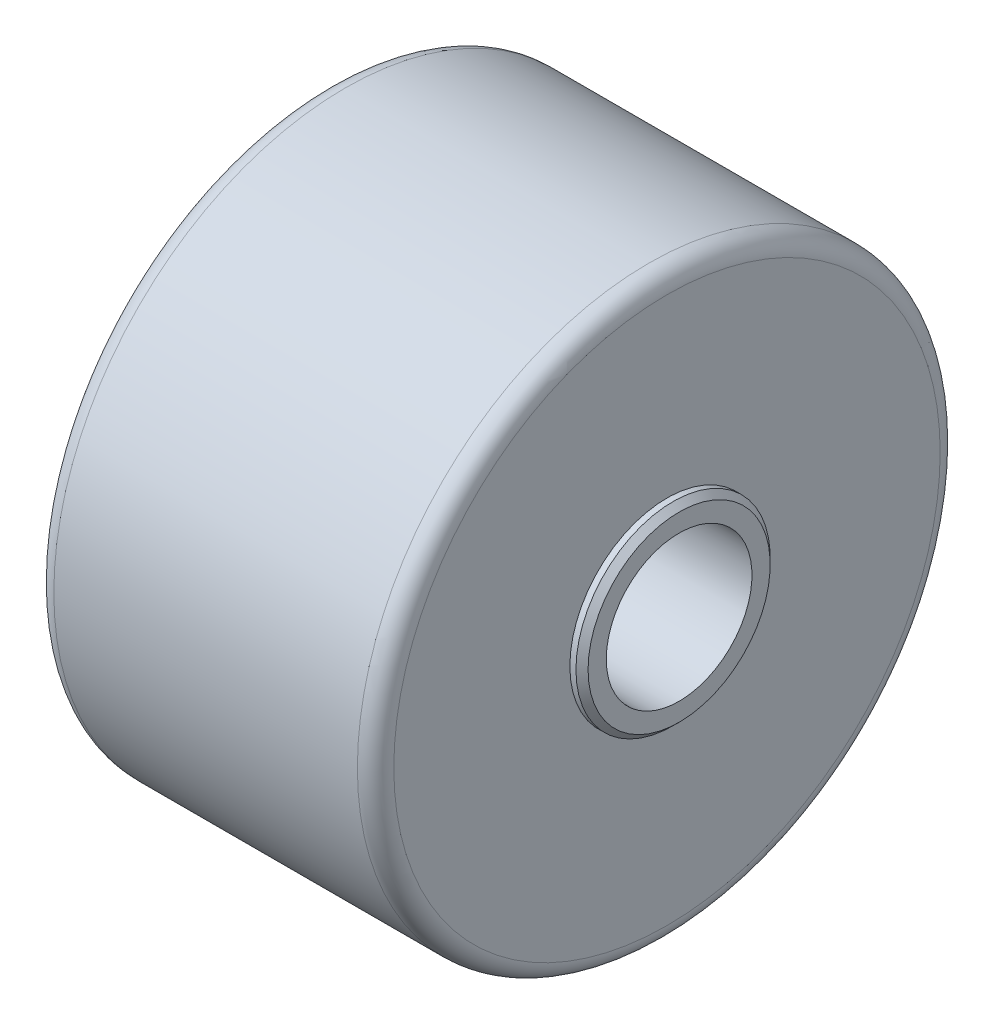
ISO-10303-21;
HEADER;
FILE_DESCRIPTION(('STEP AP214'),'2;1');
FILE_NAME('part.step','',(''),(''),'','','');
FILE_SCHEMA(('AUTOMOTIVE_DESIGN { 1 0 10303 214 1 1 1 1 }'));
ENDSEC;
DATA;
#1=APPLICATION_CONTEXT('core data for automotive mechanical design processes');
#2=APPLICATION_PROTOCOL_DEFINITION('international standard','automotive_design',2000,#1);
#3=PRODUCT_CONTEXT('',#1,'mechanical');
#4=PRODUCT('Part','Part','',(#3));
#5=PRODUCT_RELATED_PRODUCT_CATEGORY('part','',(#4));
#6=PRODUCT_DEFINITION_FORMATION('','',#4);
#7=PRODUCT_DEFINITION_CONTEXT('part definition',#1,'design');
#8=PRODUCT_DEFINITION('design','',#6,#7);
#9=PRODUCT_DEFINITION_SHAPE('','',#8);
#10=(LENGTH_UNIT() NAMED_UNIT(*) SI_UNIT(.MILLI.,.METRE.));
#11=(NAMED_UNIT(*) PLANE_ANGLE_UNIT() SI_UNIT($,.RADIAN.));
#12=(NAMED_UNIT(*) SI_UNIT($,.STERADIAN.) SOLID_ANGLE_UNIT());
#13=UNCERTAINTY_MEASURE_WITH_UNIT(LENGTH_MEASURE(1.E-05),#10,'distance_accuracy_value','');
#14=(GEOMETRIC_REPRESENTATION_CONTEXT(3) GLOBAL_UNCERTAINTY_ASSIGNED_CONTEXT((#13)) GLOBAL_UNIT_ASSIGNED_CONTEXT((#10,
#11,#12)) REPRESENTATION_CONTEXT('',''));
#15=CARTESIAN_POINT('',(0.,0.,0.));
#16=DIRECTION('',(0.,0.,1.));
#17=DIRECTION('',(1.,0.,0.));
#18=AXIS2_PLACEMENT_3D('',#15,#16,#17);
#19=CARTESIAN_POINT('',(50.,0.,0.));
#20=DIRECTION('',(-1.,0.,0.));
#21=DIRECTION('',(0.,0.,1.));
#22=AXIS2_PLACEMENT_3D('',#19,#20,#21);
#23=CYLINDRICAL_SURFACE('',#22,12.);
#24=CARTESIAN_POINT('',(-30.,0.,0.));
#25=DIRECTION('',(-1.,0.,0.));
#26=DIRECTION('',(0.,0.,1.));
#27=AXIS2_PLACEMENT_3D('',#24,#25,#26);
#28=CIRCLE('',#27,12.);
#29=CARTESIAN_POINT('',(-30.,0.,12.));
#30=VERTEX_POINT('',#29);
#31=EDGE_CURVE('E18',#30,#30,#28,.F.);
#32=ORIENTED_EDGE('',*,*,#31,.F.);
#33=EDGE_LOOP('',(#32));
#34=FACE_BOUND('',#33,.T.);
#35=CARTESIAN_POINT('',(30.,0.,0.));
#36=DIRECTION('',(-1.,0.,0.));
#37=DIRECTION('',(0.,0.,1.));
#38=AXIS2_PLACEMENT_3D('',#35,#36,#37);
#39=CIRCLE('',#38,12.);
#40=CARTESIAN_POINT('',(30.,0.,12.));
#41=VERTEX_POINT('',#40);
#42=EDGE_CURVE('E138',#41,#41,#39,.T.);
#43=ORIENTED_EDGE('',*,*,#42,.F.);
#44=EDGE_LOOP('',(#43));
#45=FACE_BOUND('',#44,.T.);
#46=ADVANCED_FACE('F15',(#34,#45),#23,.F.);
#47=CARTESIAN_POINT('',(-30.,15.,0.));
#48=DIRECTION('',(-1.,0.,0.));
#49=DIRECTION('',(0.,0.,1.));
#50=AXIS2_PLACEMENT_3D('',#47,#48,#49);
#51=PLANE('',#50);
#52=CARTESIAN_POINT('',(-29.9999999999974,0.,0.));
#53=DIRECTION('',(1.,0.,0.));
#54=DIRECTION('',(0.,0.,-1.));
#55=AXIS2_PLACEMENT_3D('',#52,#53,#54);
#56=CIRCLE('',#55,14.9999999999974);
#57=CARTESIAN_POINT('',(-29.9999999999974,0.,-14.9999999999974));
#58=VERTEX_POINT('',#57);
#59=EDGE_CURVE('E136',#58,#58,#56,.T.);
#60=ORIENTED_EDGE('',*,*,#59,.F.);
#61=EDGE_LOOP('',(#60));
#62=FACE_BOUND('',#61,.T.);
#63=ORIENTED_EDGE('',*,*,#31,.T.);
#64=EDGE_LOOP('',(#63));
#65=FACE_BOUND('',#64,.T.);
#66=ADVANCED_FACE('F100',(#62,#65),#51,.T.);
#67=CARTESIAN_POINT('',(30.,12.,0.));
#68=DIRECTION('',(1.,0.,0.));
#69=DIRECTION('',(0.,0.,-1.));
#70=AXIS2_PLACEMENT_3D('',#67,#68,#69);
#71=PLANE('',#70);
#72=ORIENTED_EDGE('',*,*,#42,.T.);
#73=EDGE_LOOP('',(#72));
#74=FACE_BOUND('',#73,.T.);
#75=CARTESIAN_POINT('',(30.,0.,0.));
#76=DIRECTION('',(-1.,0.,0.));
#77=DIRECTION('',(0.,0.,1.));
#78=AXIS2_PLACEMENT_3D('',#75,#76,#77);
#79=CIRCLE('',#78,15.);
#80=CARTESIAN_POINT('',(30.,0.,15.));
#81=VERTEX_POINT('',#80);
#82=EDGE_CURVE('E132',#81,#81,#79,.T.);
#83=ORIENTED_EDGE('',*,*,#82,.F.);
#84=EDGE_LOOP('',(#83));
#85=FACE_BOUND('',#84,.T.);
#86=ADVANCED_FACE('F97',(#74,#85),#71,.T.);
#87=CARTESIAN_POINT('',(-29.,0.,0.));
#88=DIRECTION('',(1.,0.,0.));
#89=DIRECTION('',(0.,0.,-1.));
#90=AXIS2_PLACEMENT_3D('',#87,#88,#89);
#91=CONICAL_SURFACE('',#90,16.,0.7853981634);
#92=CARTESIAN_POINT('',(-29.,0.,0.));
#93=DIRECTION('',(-1.,0.,0.));
#94=DIRECTION('',(0.,0.,1.));
#95=AXIS2_PLACEMENT_3D('',#92,#93,#94);
#96=CIRCLE('',#95,16.);
#97=CARTESIAN_POINT('',(-29.,0.,16.));
#98=VERTEX_POINT('',#97);
#99=EDGE_CURVE('E135',#98,#98,#96,.F.);
#100=ORIENTED_EDGE('',*,*,#99,.F.);
#101=EDGE_LOOP('',(#100));
#102=FACE_BOUND('',#101,.T.);
#103=ORIENTED_EDGE('',*,*,#59,.T.);
#104=EDGE_LOOP('',(#103));
#105=FACE_BOUND('',#104,.T.);
#106=ADVANCED_FACE('F93',(#102,#105),#91,.T.);
#107=CARTESIAN_POINT('',(29.0000000000026,0.,0.));
#108=DIRECTION('',(-1.,0.,0.));
#109=DIRECTION('',(0.,0.,1.));
#110=AXIS2_PLACEMENT_3D('',#107,#108,#109);
#111=CONICAL_SURFACE('',#110,16.0000000000026,0.7853981634);
#112=ORIENTED_EDGE('',*,*,#82,.T.);
#113=EDGE_LOOP('',(#112));
#114=FACE_BOUND('',#113,.T.);
#115=CARTESIAN_POINT('',(29.,0.,0.));
#116=DIRECTION('',(-1.,0.,0.));
#117=DIRECTION('',(0.,0.,1.));
#118=AXIS2_PLACEMENT_3D('',#115,#116,#117);
#119=CIRCLE('',#118,16.);
#120=CARTESIAN_POINT('',(29.,0.,16.));
#121=VERTEX_POINT('',#120);
#122=EDGE_CURVE('E126',#121,#121,#119,.T.);
#123=ORIENTED_EDGE('',*,*,#122,.F.);
#124=EDGE_LOOP('',(#123));
#125=FACE_BOUND('',#124,.T.);
#126=ADVANCED_FACE('F89',(#114,#125),#111,.T.);
#127=CARTESIAN_POINT('',(50.,0.,0.));
#128=DIRECTION('',(-1.,0.,0.));
#129=DIRECTION('',(0.,0.,1.));
#130=AXIS2_PLACEMENT_3D('',#127,#128,#129);
#131=CYLINDRICAL_SURFACE('',#130,16.);
#132=CARTESIAN_POINT('',(-28.,0.,0.));
#133=DIRECTION('',(-1.,0.,0.));
#134=DIRECTION('',(0.,0.,1.));
#135=AXIS2_PLACEMENT_3D('',#132,#133,#134);
#136=CIRCLE('',#135,16.);
#137=CARTESIAN_POINT('',(-28.,0.,16.));
#138=VERTEX_POINT('',#137);
#139=EDGE_CURVE('E121',#138,#138,#136,.F.);
#140=ORIENTED_EDGE('',*,*,#139,.F.);
#141=EDGE_LOOP('',(#140));
#142=FACE_BOUND('',#141,.T.);
#143=ORIENTED_EDGE('',*,*,#99,.T.);
#144=EDGE_LOOP('',(#143));
#145=FACE_BOUND('',#144,.T.);
#146=ADVANCED_FACE('F85',(#142,#145),#131,.T.);
#147=CARTESIAN_POINT('',(50.,0.,0.));
#148=DIRECTION('',(-1.,0.,0.));
#149=DIRECTION('',(0.,0.,1.));
#150=AXIS2_PLACEMENT_3D('',#147,#148,#149);
#151=CYLINDRICAL_SURFACE('',#150,16.);
#152=ORIENTED_EDGE('',*,*,#122,.T.);
#153=EDGE_LOOP('',(#152));
#154=FACE_BOUND('',#153,.T.);
#155=CARTESIAN_POINT('',(28.,0.,0.));
#156=DIRECTION('',(-1.,0.,0.));
#157=DIRECTION('',(0.,0.,1.));
#158=AXIS2_PLACEMENT_3D('',#155,#156,#157);
#159=CIRCLE('',#158,16.);
#160=CARTESIAN_POINT('',(28.,0.,16.));
#161=VERTEX_POINT('',#160);
#162=EDGE_CURVE('E119',#161,#161,#159,.T.);
#163=ORIENTED_EDGE('',*,*,#162,.F.);
#164=EDGE_LOOP('',(#163));
#165=FACE_BOUND('',#164,.T.);
#166=ADVANCED_FACE('F81',(#154,#165),#151,.T.);
#167=CARTESIAN_POINT('',(-28.,45.,0.));
#168=DIRECTION('',(-1.,0.,0.));
#169=DIRECTION('',(0.,0.,1.));
#170=AXIS2_PLACEMENT_3D('',#167,#168,#169);
#171=PLANE('',#170);
#172=CARTESIAN_POINT('',(-28.,0.,0.));
#173=DIRECTION('',(1.,0.,0.));
#174=DIRECTION('',(0.,0.,-1.));
#175=AXIS2_PLACEMENT_3D('',#172,#173,#174);
#176=CIRCLE('',#175,45.);
#177=CARTESIAN_POINT('',(-28.,0.,-45.));
#178=VERTEX_POINT('',#177);
#179=EDGE_CURVE('E65',#178,#178,#176,.T.);
#180=ORIENTED_EDGE('',*,*,#179,.F.);
#181=EDGE_LOOP('',(#180));
#182=FACE_BOUND('',#181,.T.);
#183=ORIENTED_EDGE('',*,*,#139,.T.);
#184=EDGE_LOOP('',(#183));
#185=FACE_BOUND('',#184,.T.);
#186=ADVANCED_FACE('F71',(#182,#185),#171,.T.);
#187=CARTESIAN_POINT('',(28.,16.,0.));
#188=DIRECTION('',(1.,0.,0.));
#189=DIRECTION('',(0.,0.,-1.));
#190=AXIS2_PLACEMENT_3D('',#187,#188,#189);
#191=PLANE('',#190);
#192=ORIENTED_EDGE('',*,*,#162,.T.);
#193=EDGE_LOOP('',(#192));
#194=FACE_BOUND('',#193,.T.);
#195=CARTESIAN_POINT('',(28.,0.,0.));
#196=DIRECTION('',(-1.,0.,0.));
#197=DIRECTION('',(0.,0.,-1.));
#198=AXIS2_PLACEMENT_3D('',#195,#196,#197);
#199=CIRCLE('',#198,45.);
#200=CARTESIAN_POINT('',(28.,0.,-45.));
#201=VERTEX_POINT('',#200);
#202=EDGE_CURVE('E27',#201,#201,#199,.T.);
#203=ORIENTED_EDGE('',*,*,#202,.F.);
#204=EDGE_LOOP('',(#203));
#205=FACE_BOUND('',#204,.T.);
#206=ADVANCED_FACE('F80',(#194,#205),#191,.T.);
#207=CARTESIAN_POINT('',(-25.,0.,0.));
#208=DIRECTION('',(1.,0.,0.));
#209=DIRECTION('',(0.,0.,-1.));
#210=AXIS2_PLACEMENT_3D('',#207,#208,#209);
#211=TOROIDAL_SURFACE('',#210,45.,3.);
#212=CARTESIAN_POINT('',(-25.,0.,0.));
#213=DIRECTION('',(-1.,0.,0.));
#214=DIRECTION('',(0.,0.,1.));
#215=AXIS2_PLACEMENT_3D('',#212,#213,#214);
#216=CIRCLE('',#215,48.);
#217=CARTESIAN_POINT('',(-25.,0.,48.));
#218=VERTEX_POINT('',#217);
#219=EDGE_CURVE('E22',#218,#218,#216,.F.);
#220=ORIENTED_EDGE('',*,*,#219,.F.);
#221=EDGE_LOOP('',(#220));
#222=FACE_BOUND('',#221,.T.);
#223=ORIENTED_EDGE('',*,*,#179,.T.);
#224=EDGE_LOOP('',(#223));
#225=FACE_BOUND('',#224,.T.);
#226=ADVANCED_FACE('F45',(#222,#225),#211,.T.);
#227=CARTESIAN_POINT('',(25.,0.,0.));
#228=DIRECTION('',(1.,0.,0.));
#229=DIRECTION('',(0.,0.,-1.));
#230=AXIS2_PLACEMENT_3D('',#227,#228,#229);
#231=TOROIDAL_SURFACE('',#230,45.,3.);
#232=ORIENTED_EDGE('',*,*,#202,.T.);
#233=EDGE_LOOP('',(#232));
#234=FACE_BOUND('',#233,.T.);
#235=CARTESIAN_POINT('',(25.,0.,0.));
#236=DIRECTION('',(-1.,0.,0.));
#237=DIRECTION('',(0.,0.,1.));
#238=AXIS2_PLACEMENT_3D('',#235,#236,#237);
#239=CIRCLE('',#238,48.);
#240=CARTESIAN_POINT('',(25.,0.,48.));
#241=VERTEX_POINT('',#240);
#242=EDGE_CURVE('E10',#241,#241,#239,.T.);
#243=ORIENTED_EDGE('',*,*,#242,.F.);
#244=EDGE_LOOP('',(#243));
#245=FACE_BOUND('',#244,.T.);
#246=ADVANCED_FACE('F39',(#234,#245),#231,.T.);
#247=CARTESIAN_POINT('',(50.,0.,0.));
#248=DIRECTION('',(-1.,0.,0.));
#249=DIRECTION('',(0.,0.,1.));
#250=AXIS2_PLACEMENT_3D('',#247,#248,#249);
#251=CYLINDRICAL_SURFACE('',#250,48.);
#252=ORIENTED_EDGE('',*,*,#242,.T.);
#253=EDGE_LOOP('',(#252));
#254=FACE_BOUND('',#253,.T.);
#255=ORIENTED_EDGE('',*,*,#219,.T.);
#256=EDGE_LOOP('',(#255));
#257=FACE_BOUND('',#256,.T.);
#258=ADVANCED_FACE('F44',(#254,#257),#251,.T.);
#259=CLOSED_SHELL('',(#46,#66,#86,#106,#126,#146,#166,#186,#206,#226,#246,#258));
#260=MANIFOLD_SOLID_BREP('B1',#259);
#261=ADVANCED_BREP_SHAPE_REPRESENTATION('',(#18,#260),#14);
#262=SHAPE_DEFINITION_REPRESENTATION(#9,#261);
ENDSEC;
END-ISO-10303-21;
